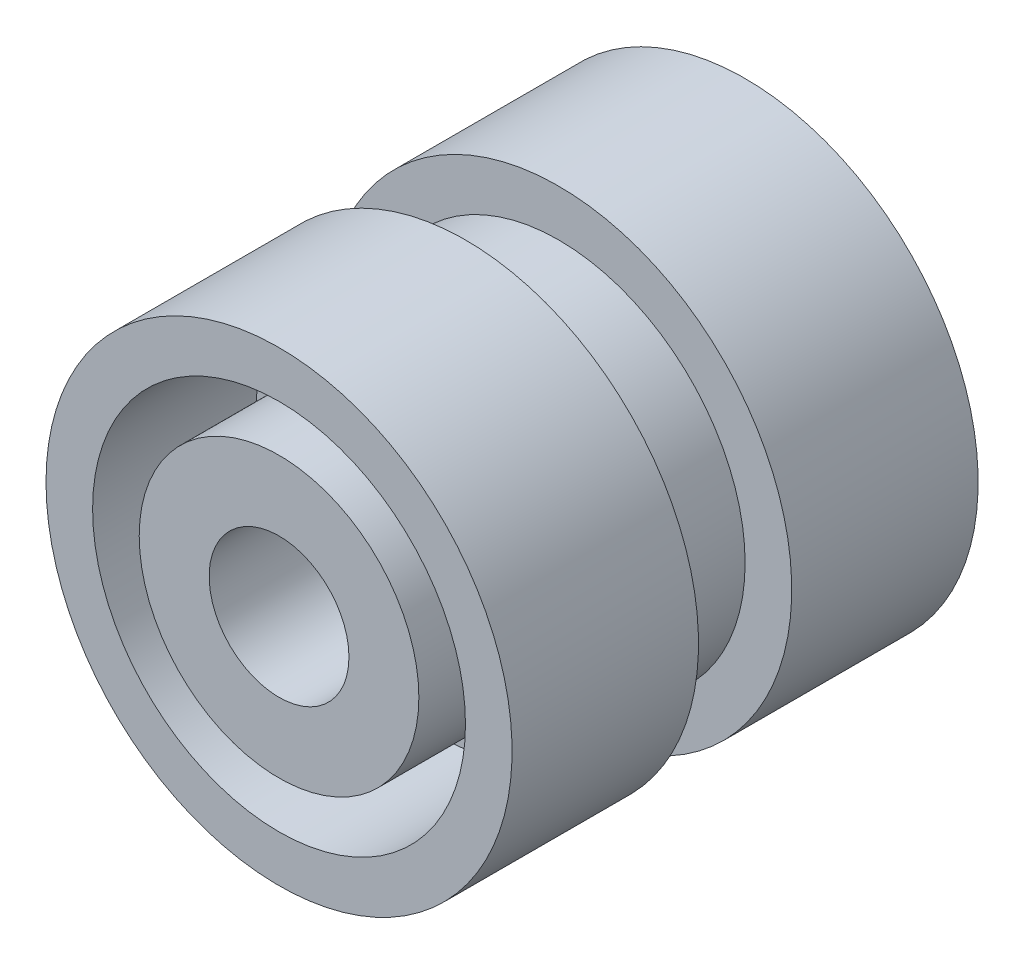
ISO-10303-21;
HEADER;
FILE_DESCRIPTION(('STEP AP214'),'2;1');
FILE_NAME('part.step','',(''),(''),'','','');
FILE_SCHEMA(('AUTOMOTIVE_DESIGN { 1 0 10303 214 1 1 1 1 }'));
ENDSEC;
DATA;
#1=APPLICATION_CONTEXT('core data for automotive mechanical design processes');
#2=APPLICATION_PROTOCOL_DEFINITION('international standard','automotive_design',2000,#1);
#3=PRODUCT_CONTEXT('',#1,'mechanical');
#4=PRODUCT('Part','Part','',(#3));
#5=PRODUCT_RELATED_PRODUCT_CATEGORY('part','',(#4));
#6=PRODUCT_DEFINITION_FORMATION('','',#4);
#7=PRODUCT_DEFINITION_CONTEXT('part definition',#1,'design');
#8=PRODUCT_DEFINITION('design','',#6,#7);
#9=PRODUCT_DEFINITION_SHAPE('','',#8);
#10=(LENGTH_UNIT() NAMED_UNIT(*) SI_UNIT(.MILLI.,.METRE.));
#11=(NAMED_UNIT(*) PLANE_ANGLE_UNIT() SI_UNIT($,.RADIAN.));
#12=(NAMED_UNIT(*) SI_UNIT($,.STERADIAN.) SOLID_ANGLE_UNIT());
#13=UNCERTAINTY_MEASURE_WITH_UNIT(LENGTH_MEASURE(1.E-05),#10,'distance_accuracy_value','');
#14=(GEOMETRIC_REPRESENTATION_CONTEXT(3) GLOBAL_UNCERTAINTY_ASSIGNED_CONTEXT((#13)) GLOBAL_UNIT_ASSIGNED_CONTEXT((#10,
#11,#12)) REPRESENTATION_CONTEXT('',''));
#15=CARTESIAN_POINT('',(0.,0.,0.));
#16=DIRECTION('',(0.,0.,1.));
#17=DIRECTION('',(1.,0.,0.));
#18=AXIS2_PLACEMENT_3D('',#15,#16,#17);
#19=CARTESIAN_POINT('',(0.,4.,-1.5));
#20=DIRECTION('',(0.,0.,-1.));
#21=DIRECTION('',(-1.,0.,0.));
#22=AXIS2_PLACEMENT_3D('',#19,#20,#21);
#23=PLANE('',#22);
#24=CARTESIAN_POINT('',(0.,0.,-1.5));
#25=DIRECTION('',(0.,0.,-1.));
#26=DIRECTION('',(-1.,0.,0.));
#27=AXIS2_PLACEMENT_3D('',#24,#25,#26);
#28=CIRCLE('',#27,2.);
#29=CARTESIAN_POINT('',(1.93649167310371,-0.5,-1.5));
#30=VERTEX_POINT('',#29);
#31=CARTESIAN_POINT('',(0.5,-1.93649167310371,-1.5));
#32=VERTEX_POINT('',#31);
#33=EDGE_CURVE('E54',#30,#32,#28,.T.);
#34=ORIENTED_EDGE('',*,*,#33,.F.);
#35=DIRECTION('',(-1.,0.,0.));
#36=VECTOR('',#35,1.);
#37=CARTESIAN_POINT('',(1.93649167310371,-0.5,-1.5));
#38=LINE('',#37,#36);
#39=CARTESIAN_POINT('',(3.96862696659689,-0.500000000000001,-1.5));
#40=VERTEX_POINT('',#39);
#41=EDGE_CURVE('E275',#40,#30,#38,.T.);
#42=ORIENTED_EDGE('',*,*,#41,.F.);
#43=CARTESIAN_POINT('',(0.,0.,-1.5));
#44=DIRECTION('',(0.,0.,-1.));
#45=DIRECTION('',(-1.,0.,0.));
#46=AXIS2_PLACEMENT_3D('',#43,#44,#45);
#47=CIRCLE('',#46,4.);
#48=CARTESIAN_POINT('',(0.500000000000001,-3.96862696659689,-1.5));
#49=VERTEX_POINT('',#48);
#50=EDGE_CURVE('E185',#40,#49,#47,.T.);
#51=ORIENTED_EDGE('',*,*,#50,.T.);
#52=DIRECTION('',(0.,-1.,0.));
#53=VECTOR('',#52,1.);
#54=CARTESIAN_POINT('',(0.5,-1.93649167310371,-1.5));
#55=LINE('',#54,#53);
#56=EDGE_CURVE('E59',#32,#49,#55,.T.);
#57=ORIENTED_EDGE('',*,*,#56,.F.);
#58=EDGE_LOOP('',(#34,#42,#51,#57));
#59=FACE_BOUND('',#58,.T.);
#60=ADVANCED_FACE('F39',(#59),#23,.T.);
#61=CARTESIAN_POINT('',(0.,0.,-1.5));
#62=DIRECTION('',(0.,0.,-1.));
#63=DIRECTION('',(-1.,0.,0.));
#64=AXIS2_PLACEMENT_3D('',#61,#62,#63);
#65=CIRCLE('',#64,2.);
#66=CARTESIAN_POINT('',(-0.5,-1.93649167310371,-1.5));
#67=VERTEX_POINT('',#66);
#68=CARTESIAN_POINT('',(-1.93649167310371,-0.499999999999999,-1.5));
#69=VERTEX_POINT('',#68);
#70=EDGE_CURVE('E292',#67,#69,#65,.T.);
#71=ORIENTED_EDGE('',*,*,#70,.F.);
#72=DIRECTION('',(0.,1.,0.));
#73=VECTOR('',#72,1.);
#74=CARTESIAN_POINT('',(-0.5,-1.93649167310371,-1.5));
#75=LINE('',#74,#73);
#76=CARTESIAN_POINT('',(-0.5,-3.96862696659689,-1.5));
#77=VERTEX_POINT('',#76);
#78=EDGE_CURVE('E288',#77,#67,#75,.T.);
#79=ORIENTED_EDGE('',*,*,#78,.F.);
#80=CARTESIAN_POINT('',(-3.96862696659689,-0.500000000000001,-1.5));
#81=VERTEX_POINT('',#80);
#82=EDGE_CURVE('E180',#77,#81,#47,.T.);
#83=ORIENTED_EDGE('',*,*,#82,.T.);
#84=DIRECTION('',(-1.,0.,0.));
#85=VECTOR('',#84,1.);
#86=CARTESIAN_POINT('',(-1.93649167310371,-0.5,-1.5));
#87=LINE('',#86,#85);
#88=EDGE_CURVE('E296',#69,#81,#87,.T.);
#89=ORIENTED_EDGE('',*,*,#88,.F.);
#90=EDGE_LOOP('',(#71,#79,#83,#89));
#91=FACE_BOUND('',#90,.T.);
#92=ADVANCED_FACE('F251',(#91),#23,.T.);
#93=CARTESIAN_POINT('',(0.,0.,-1.5));
#94=DIRECTION('',(0.,0.,-1.));
#95=DIRECTION('',(-1.,0.,0.));
#96=AXIS2_PLACEMENT_3D('',#93,#94,#95);
#97=CIRCLE('',#96,2.);
#98=CARTESIAN_POINT('',(-1.93649167310371,0.5,-1.5));
#99=VERTEX_POINT('',#98);
#100=CARTESIAN_POINT('',(-0.5,1.93649167310371,-1.5));
#101=VERTEX_POINT('',#100);
#102=EDGE_CURVE('E304',#99,#101,#97,.T.);
#103=ORIENTED_EDGE('',*,*,#102,.F.);
#104=DIRECTION('',(1.,0.,0.));
#105=VECTOR('',#104,1.);
#106=CARTESIAN_POINT('',(-1.93649167310371,0.5,-1.5));
#107=LINE('',#106,#105);
#108=CARTESIAN_POINT('',(-3.96862696659689,0.5,-1.5));
#109=VERTEX_POINT('',#108);
#110=EDGE_CURVE('E300',#109,#99,#107,.T.);
#111=ORIENTED_EDGE('',*,*,#110,.F.);
#112=CARTESIAN_POINT('',(-0.5,3.96862696659689,-1.5));
#113=VERTEX_POINT('',#112);
#114=EDGE_CURVE('E187',#109,#113,#47,.T.);
#115=ORIENTED_EDGE('',*,*,#114,.T.);
#116=DIRECTION('',(0.,1.,0.));
#117=VECTOR('',#116,1.);
#118=CARTESIAN_POINT('',(-0.5,1.93649167310371,-1.5));
#119=LINE('',#118,#117);
#120=EDGE_CURVE('E308',#101,#113,#119,.T.);
#121=ORIENTED_EDGE('',*,*,#120,.F.);
#122=EDGE_LOOP('',(#103,#111,#115,#121));
#123=FACE_BOUND('',#122,.T.);
#124=ADVANCED_FACE('F256',(#123),#23,.T.);
#125=CARTESIAN_POINT('',(0.5,3.96862696659689,-1.5));
#126=VERTEX_POINT('',#125);
#127=CARTESIAN_POINT('',(3.96862696659689,0.499999999999999,-1.5));
#128=VERTEX_POINT('',#127);
#129=EDGE_CURVE('E195',#126,#128,#47,.T.);
#130=ORIENTED_EDGE('',*,*,#129,.T.);
#131=DIRECTION('',(1.,0.,0.));
#132=VECTOR('',#131,1.);
#133=CARTESIAN_POINT('',(1.93649167310371,0.5,-1.5));
#134=LINE('',#133,#132);
#135=CARTESIAN_POINT('',(1.93649167310371,0.5,-1.5));
#136=VERTEX_POINT('',#135);
#137=EDGE_CURVE('E269',#136,#128,#134,.T.);
#138=ORIENTED_EDGE('',*,*,#137,.F.);
#139=CARTESIAN_POINT('',(0.,0.,-1.5));
#140=DIRECTION('',(0.,0.,-1.));
#141=DIRECTION('',(-1.,0.,0.));
#142=AXIS2_PLACEMENT_3D('',#139,#140,#141);
#143=CIRCLE('',#142,2.);
#144=CARTESIAN_POINT('',(0.5,1.93649167310371,-1.5));
#145=VERTEX_POINT('',#144);
#146=EDGE_CURVE('E178',#145,#136,#143,.T.);
#147=ORIENTED_EDGE('',*,*,#146,.F.);
#148=DIRECTION('',(0.,-1.,0.));
#149=VECTOR('',#148,1.);
#150=CARTESIAN_POINT('',(0.5,1.93649167310371,-1.5));
#151=LINE('',#150,#149);
#152=EDGE_CURVE('E175',#126,#145,#151,.T.);
#153=ORIENTED_EDGE('',*,*,#152,.F.);
#154=EDGE_LOOP('',(#130,#138,#147,#153));
#155=FACE_BOUND('',#154,.T.);
#156=ADVANCED_FACE('F252',(#155),#23,.T.);
#157=CARTESIAN_POINT('',(0.,0.,0.));
#158=DIRECTION('',(0.,0.,-1.));
#159=DIRECTION('',(-1.,0.,0.));
#160=AXIS2_PLACEMENT_3D('',#157,#158,#159);
#161=CYLINDRICAL_SURFACE('',#160,4.);
#162=CARTESIAN_POINT('',(0.,0.,-5.));
#163=DIRECTION('',(0.,0.,-1.));
#164=DIRECTION('',(-1.,0.,0.));
#165=AXIS2_PLACEMENT_3D('',#162,#163,#164);
#166=CIRCLE('',#165,4.);
#167=CARTESIAN_POINT('',(-4.,0.,-5.));
#168=VERTEX_POINT('',#167);
#169=EDGE_CURVE('E194',#168,#168,#166,.T.);
#170=ORIENTED_EDGE('',*,*,#169,.T.);
#171=EDGE_LOOP('',(#170));
#172=FACE_BOUND('',#171,.T.);
#173=CARTESIAN_POINT('',(0.,0.,-3.5));
#174=DIRECTION('',(0.,0.,-1.));
#175=DIRECTION('',(-1.,0.,0.));
#176=AXIS2_PLACEMENT_3D('',#173,#174,#175);
#177=CIRCLE('',#176,4.);
#178=CARTESIAN_POINT('',(-0.5,3.96862696659689,-3.5));
#179=VERTEX_POINT('',#178);
#180=CARTESIAN_POINT('',(0.5,3.96862696659689,-3.5));
#181=VERTEX_POINT('',#180);
#182=EDGE_CURVE('E408',#179,#181,#177,.T.);
#183=ORIENTED_EDGE('',*,*,#182,.F.);
#184=DIRECTION('',(0.,0.,1.));
#185=VECTOR('',#184,1.);
#186=CARTESIAN_POINT('',(-0.5,3.96862696659689,-3.5));
#187=LINE('',#186,#185);
#188=EDGE_CURVE('E320',#179,#113,#187,.T.);
#189=ORIENTED_EDGE('',*,*,#188,.T.);
#190=ORIENTED_EDGE('',*,*,#114,.F.);
#191=DIRECTION('',(0.,0.,1.));
#192=VECTOR('',#191,1.);
#193=CARTESIAN_POINT('',(-3.96862696659689,0.5,-3.5));
#194=LINE('',#193,#192);
#195=CARTESIAN_POINT('',(-3.96862696659689,0.5,-3.5));
#196=VERTEX_POINT('',#195);
#197=EDGE_CURVE('E331',#196,#109,#194,.T.);
#198=ORIENTED_EDGE('',*,*,#197,.F.);
#199=CARTESIAN_POINT('',(0.,0.,-3.5));
#200=DIRECTION('',(0.,0.,-1.));
#201=DIRECTION('',(-1.,0.,0.));
#202=AXIS2_PLACEMENT_3D('',#199,#200,#201);
#203=CIRCLE('',#202,4.);
#204=CARTESIAN_POINT('',(-3.96862696659689,-0.5,-3.5));
#205=VERTEX_POINT('',#204);
#206=EDGE_CURVE('E394',#205,#196,#203,.T.);
#207=ORIENTED_EDGE('',*,*,#206,.F.);
#208=DIRECTION('',(0.,0.,1.));
#209=VECTOR('',#208,1.);
#210=CARTESIAN_POINT('',(-3.96862696659689,-0.500000000000001,-3.5));
#211=LINE('',#210,#209);
#212=EDGE_CURVE('E335',#205,#81,#211,.T.);
#213=ORIENTED_EDGE('',*,*,#212,.T.);
#214=ORIENTED_EDGE('',*,*,#82,.F.);
#215=DIRECTION('',(0.,0.,1.));
#216=VECTOR('',#215,1.);
#217=CARTESIAN_POINT('',(-0.5,-3.96862696659689,-3.5));
#218=LINE('',#217,#216);
#219=CARTESIAN_POINT('',(-0.5,-3.96862696659689,-3.5));
#220=VERTEX_POINT('',#219);
#221=EDGE_CURVE('E346',#220,#77,#218,.T.);
#222=ORIENTED_EDGE('',*,*,#221,.F.);
#223=CARTESIAN_POINT('',(0.,0.,-3.5));
#224=DIRECTION('',(0.,0.,-1.));
#225=DIRECTION('',(-1.,0.,0.));
#226=AXIS2_PLACEMENT_3D('',#223,#224,#225);
#227=CIRCLE('',#226,4.);
#228=CARTESIAN_POINT('',(0.5,-3.96862696659689,-3.5));
#229=VERTEX_POINT('',#228);
#230=EDGE_CURVE('E380',#229,#220,#227,.T.);
#231=ORIENTED_EDGE('',*,*,#230,.F.);
#232=DIRECTION('',(0.,0.,1.));
#233=VECTOR('',#232,1.);
#234=CARTESIAN_POINT('',(0.500000000000001,-3.96862696659689,-3.5));
#235=LINE('',#234,#233);
#236=EDGE_CURVE('E350',#229,#49,#235,.T.);
#237=ORIENTED_EDGE('',*,*,#236,.T.);
#238=ORIENTED_EDGE('',*,*,#50,.F.);
#239=DIRECTION('',(0.,0.,1.));
#240=VECTOR('',#239,1.);
#241=CARTESIAN_POINT('',(3.96862696659689,-0.500000000000001,-3.5));
#242=LINE('',#241,#240);
#243=CARTESIAN_POINT('',(3.96862696659689,-0.500000000000001,-3.5));
#244=VERTEX_POINT('',#243);
#245=EDGE_CURVE('E188',#244,#40,#242,.T.);
#246=ORIENTED_EDGE('',*,*,#245,.F.);
#247=CARTESIAN_POINT('',(0.,0.,-3.5));
#248=DIRECTION('',(0.,0.,-1.));
#249=DIRECTION('',(-1.,0.,0.));
#250=AXIS2_PLACEMENT_3D('',#247,#248,#249);
#251=CIRCLE('',#250,4.);
#252=CARTESIAN_POINT('',(3.96862696659689,0.499999999999999,-3.5));
#253=VERTEX_POINT('',#252);
#254=EDGE_CURVE('E163',#253,#244,#251,.T.);
#255=ORIENTED_EDGE('',*,*,#254,.F.);
#256=DIRECTION('',(0.,0.,1.));
#257=VECTOR('',#256,1.);
#258=CARTESIAN_POINT('',(3.96862696659689,0.499999999999999,-3.5));
#259=LINE('',#258,#257);
#260=EDGE_CURVE('E159',#253,#128,#259,.T.);
#261=ORIENTED_EDGE('',*,*,#260,.T.);
#262=ORIENTED_EDGE('',*,*,#129,.F.);
#263=DIRECTION('',(0.,0.,1.));
#264=VECTOR('',#263,1.);
#265=CARTESIAN_POINT('',(0.5,3.96862696659689,-3.5));
#266=LINE('',#265,#264);
#267=EDGE_CURVE('E317',#181,#126,#266,.T.);
#268=ORIENTED_EDGE('',*,*,#267,.F.);
#269=EDGE_LOOP('',(#183,#189,#190,#198,#207,#213,#214,#222,#231,#237,#238,#246,#255,#261,#262,#268));
#270=FACE_BOUND('',#269,.T.);
#271=ADVANCED_FACE('F248',(#172,#270),#161,.F.);
#272=CARTESIAN_POINT('',(0.,0.,5.));
#273=DIRECTION('',(0.,0.,1.));
#274=DIRECTION('',(1.,0.,0.));
#275=AXIS2_PLACEMENT_3D('',#272,#273,#274);
#276=PLANE('',#275);
#277=CARTESIAN_POINT('',(0.,0.,5.));
#278=DIRECTION('',(0.,0.,1.));
#279=DIRECTION('',(1.,0.,0.));
#280=AXIS2_PLACEMENT_3D('',#277,#278,#279);
#281=CIRCLE('',#280,1.5);
#282=CARTESIAN_POINT('',(1.5,0.,5.));
#283=VERTEX_POINT('',#282);
#284=EDGE_CURVE('E630',#283,#283,#281,.T.);
#285=ORIENTED_EDGE('',*,*,#284,.F.);
#286=EDGE_LOOP('',(#285));
#287=FACE_BOUND('',#286,.T.);
#288=CARTESIAN_POINT('',(0.,0.,5.));
#289=DIRECTION('',(0.,0.,-1.));
#290=DIRECTION('',(-1.,0.,0.));
#291=AXIS2_PLACEMENT_3D('',#288,#289,#290);
#292=CIRCLE('',#291,3.);
#293=CARTESIAN_POINT('',(-3.,0.,5.));
#294=VERTEX_POINT('',#293);
#295=EDGE_CURVE('E11',#294,#294,#292,.T.);
#296=ORIENTED_EDGE('',*,*,#295,.F.);
#297=EDGE_LOOP('',(#296));
#298=FACE_BOUND('',#297,.T.);
#299=ADVANCED_FACE('F239',(#287,#298),#276,.T.);
#300=CARTESIAN_POINT('',(0.,0.,0.));
#301=DIRECTION('',(0.,0.,-1.));
#302=DIRECTION('',(-1.,0.,0.));
#303=AXIS2_PLACEMENT_3D('',#300,#301,#302);
#304=CYLINDRICAL_SURFACE('',#303,3.);
#305=ORIENTED_EDGE('',*,*,#295,.T.);
#306=EDGE_LOOP('',(#305));
#307=FACE_BOUND('',#306,.T.);
#308=CARTESIAN_POINT('',(0.,0.,1.5));
#309=DIRECTION('',(0.,0.,-1.));
#310=DIRECTION('',(-1.,0.,0.));
#311=AXIS2_PLACEMENT_3D('',#308,#309,#310);
#312=CIRCLE('',#311,3.);
#313=CARTESIAN_POINT('',(-3.,0.,1.5));
#314=VERTEX_POINT('',#313);
#315=EDGE_CURVE('E47',#314,#314,#312,.T.);
#316=ORIENTED_EDGE('',*,*,#315,.F.);
#317=EDGE_LOOP('',(#316));
#318=FACE_BOUND('',#317,.T.);
#319=ADVANCED_FACE('F237',(#307,#318),#304,.T.);
#320=CARTESIAN_POINT('',(0.,3.,1.5));
#321=DIRECTION('',(0.,0.,1.));
#322=DIRECTION('',(1.,0.,0.));
#323=AXIS2_PLACEMENT_3D('',#320,#321,#322);
#324=PLANE('',#323);
#325=ORIENTED_EDGE('',*,*,#315,.T.);
#326=EDGE_LOOP('',(#325));
#327=FACE_BOUND('',#326,.T.);
#328=CARTESIAN_POINT('',(0.,0.,1.5));
#329=DIRECTION('',(0.,0.,-1.));
#330=DIRECTION('',(-1.,0.,0.));
#331=AXIS2_PLACEMENT_3D('',#328,#329,#330);
#332=CIRCLE('',#331,4.);
#333=CARTESIAN_POINT('',(-4.,0.,1.5));
#334=VERTEX_POINT('',#333);
#335=EDGE_CURVE('E227',#334,#334,#332,.T.);
#336=ORIENTED_EDGE('',*,*,#335,.F.);
#337=EDGE_LOOP('',(#336));
#338=FACE_BOUND('',#337,.T.);
#339=ADVANCED_FACE('F234',(#327,#338),#324,.T.);
#340=CARTESIAN_POINT('',(0.,0.,0.));
#341=DIRECTION('',(0.,0.,-1.));
#342=DIRECTION('',(-1.,0.,0.));
#343=AXIS2_PLACEMENT_3D('',#340,#341,#342);
#344=CYLINDRICAL_SURFACE('',#343,4.);
#345=ORIENTED_EDGE('',*,*,#335,.T.);
#346=EDGE_LOOP('',(#345));
#347=FACE_BOUND('',#346,.T.);
#348=CARTESIAN_POINT('',(0.,0.,5.));
#349=DIRECTION('',(0.,0.,-1.));
#350=DIRECTION('',(-1.,0.,0.));
#351=AXIS2_PLACEMENT_3D('',#348,#349,#350);
#352=CIRCLE('',#351,4.);
#353=CARTESIAN_POINT('',(-4.,0.,5.));
#354=VERTEX_POINT('',#353);
#355=EDGE_CURVE('E223',#354,#354,#352,.T.);
#356=ORIENTED_EDGE('',*,*,#355,.F.);
#357=EDGE_LOOP('',(#356));
#358=FACE_BOUND('',#357,.T.);
#359=ADVANCED_FACE('F246',(#347,#358),#344,.F.);
#360=CARTESIAN_POINT('',(0.,4.,5.));
#361=DIRECTION('',(0.,0.,1.));
#362=DIRECTION('',(1.,0.,0.));
#363=AXIS2_PLACEMENT_3D('',#360,#361,#362);
#364=PLANE('',#363);
#365=ORIENTED_EDGE('',*,*,#355,.T.);
#366=EDGE_LOOP('',(#365));
#367=FACE_BOUND('',#366,.T.);
#368=CARTESIAN_POINT('',(0.,0.,5.));
#369=DIRECTION('',(0.,0.,-1.));
#370=DIRECTION('',(-1.,0.,0.));
#371=AXIS2_PLACEMENT_3D('',#368,#369,#370);
#372=CIRCLE('',#371,5.);
#373=CARTESIAN_POINT('',(-5.,0.,5.));
#374=VERTEX_POINT('',#373);
#375=EDGE_CURVE('E219',#374,#374,#372,.T.);
#376=ORIENTED_EDGE('',*,*,#375,.F.);
#377=EDGE_LOOP('',(#376));
#378=FACE_BOUND('',#377,.T.);
#379=ADVANCED_FACE('F485',(#367,#378),#364,.T.);
#380=CARTESIAN_POINT('',(0.,0.,0.));
#381=DIRECTION('',(0.,0.,-1.));
#382=DIRECTION('',(-1.,0.,0.));
#383=AXIS2_PLACEMENT_3D('',#380,#381,#382);
#384=CYLINDRICAL_SURFACE('',#383,5.);
#385=ORIENTED_EDGE('',*,*,#375,.T.);
#386=EDGE_LOOP('',(#385));
#387=FACE_BOUND('',#386,.T.);
#388=CARTESIAN_POINT('',(0.,0.,1.));
#389=DIRECTION('',(0.,0.,-1.));
#390=DIRECTION('',(-1.,0.,0.));
#391=AXIS2_PLACEMENT_3D('',#388,#389,#390);
#392=CIRCLE('',#391,5.);
#393=CARTESIAN_POINT('',(-5.,0.,1.));
#394=VERTEX_POINT('',#393);
#395=EDGE_CURVE('E215',#394,#394,#392,.T.);
#396=ORIENTED_EDGE('',*,*,#395,.F.);
#397=EDGE_LOOP('',(#396));
#398=FACE_BOUND('',#397,.T.);
#399=ADVANCED_FACE('F481',(#387,#398),#384,.T.);
#400=CARTESIAN_POINT('',(0.,5.,1.));
#401=DIRECTION('',(0.,0.,-1.));
#402=DIRECTION('',(-1.,0.,0.));
#403=AXIS2_PLACEMENT_3D('',#400,#401,#402);
#404=PLANE('',#403);
#405=ORIENTED_EDGE('',*,*,#395,.T.);
#406=EDGE_LOOP('',(#405));
#407=FACE_BOUND('',#406,.T.);
#408=CARTESIAN_POINT('',(0.,0.,1.));
#409=DIRECTION('',(0.,0.,-1.));
#410=DIRECTION('',(-1.,0.,0.));
#411=AXIS2_PLACEMENT_3D('',#408,#409,#410);
#412=CIRCLE('',#411,4.);
#413=CARTESIAN_POINT('',(-4.,0.,1.));
#414=VERTEX_POINT('',#413);
#415=EDGE_CURVE('E211',#414,#414,#412,.T.);
#416=ORIENTED_EDGE('',*,*,#415,.F.);
#417=EDGE_LOOP('',(#416));
#418=FACE_BOUND('',#417,.T.);
#419=ADVANCED_FACE('F477',(#407,#418),#404,.T.);
#420=CARTESIAN_POINT('',(0.,0.,0.));
#421=DIRECTION('',(0.,0.,-1.));
#422=DIRECTION('',(-1.,0.,0.));
#423=AXIS2_PLACEMENT_3D('',#420,#421,#422);
#424=CYLINDRICAL_SURFACE('',#423,4.);
#425=ORIENTED_EDGE('',*,*,#415,.T.);
#426=EDGE_LOOP('',(#425));
#427=FACE_BOUND('',#426,.T.);
#428=CARTESIAN_POINT('',(0.,0.,-1.));
#429=DIRECTION('',(0.,0.,-1.));
#430=DIRECTION('',(-1.,0.,0.));
#431=AXIS2_PLACEMENT_3D('',#428,#429,#430);
#432=CIRCLE('',#431,4.);
#433=CARTESIAN_POINT('',(-4.,0.,-1.));
#434=VERTEX_POINT('',#433);
#435=EDGE_CURVE('E207',#434,#434,#432,.T.);
#436=ORIENTED_EDGE('',*,*,#435,.F.);
#437=EDGE_LOOP('',(#436));
#438=FACE_BOUND('',#437,.T.);
#439=ADVANCED_FACE('F473',(#427,#438),#424,.T.);
#440=CARTESIAN_POINT('',(0.,5.,-1.));
#441=DIRECTION('',(0.,0.,1.));
#442=DIRECTION('',(1.,0.,0.));
#443=AXIS2_PLACEMENT_3D('',#440,#441,#442);
#444=PLANE('',#443);
#445=ORIENTED_EDGE('',*,*,#435,.T.);
#446=EDGE_LOOP('',(#445));
#447=FACE_BOUND('',#446,.T.);
#448=CARTESIAN_POINT('',(0.,0.,-1.));
#449=DIRECTION('',(0.,0.,-1.));
#450=DIRECTION('',(-1.,0.,0.));
#451=AXIS2_PLACEMENT_3D('',#448,#449,#450);
#452=CIRCLE('',#451,5.);
#453=CARTESIAN_POINT('',(-5.,0.,-1.));
#454=VERTEX_POINT('',#453);
#455=EDGE_CURVE('E203',#454,#454,#452,.T.);
#456=ORIENTED_EDGE('',*,*,#455,.F.);
#457=EDGE_LOOP('',(#456));
#458=FACE_BOUND('',#457,.T.);
#459=ADVANCED_FACE('F469',(#447,#458),#444,.T.);
#460=CARTESIAN_POINT('',(0.,0.,0.));
#461=DIRECTION('',(0.,0.,-1.));
#462=DIRECTION('',(-1.,0.,0.));
#463=AXIS2_PLACEMENT_3D('',#460,#461,#462);
#464=CYLINDRICAL_SURFACE('',#463,5.);
#465=ORIENTED_EDGE('',*,*,#455,.T.);
#466=EDGE_LOOP('',(#465));
#467=FACE_BOUND('',#466,.T.);
#468=CARTESIAN_POINT('',(0.,0.,-5.));
#469=DIRECTION('',(0.,0.,-1.));
#470=DIRECTION('',(-1.,0.,0.));
#471=AXIS2_PLACEMENT_3D('',#468,#469,#470);
#472=CIRCLE('',#471,5.);
#473=CARTESIAN_POINT('',(-5.,0.,-5.));
#474=VERTEX_POINT('',#473);
#475=EDGE_CURVE('E199',#474,#474,#472,.T.);
#476=ORIENTED_EDGE('',*,*,#475,.F.);
#477=EDGE_LOOP('',(#476));
#478=FACE_BOUND('',#477,.T.);
#479=ADVANCED_FACE('F465',(#467,#478),#464,.T.);
#480=CARTESIAN_POINT('',(0.,4.,-5.));
#481=DIRECTION('',(0.,0.,-1.));
#482=DIRECTION('',(-1.,0.,0.));
#483=AXIS2_PLACEMENT_3D('',#480,#481,#482);
#484=PLANE('',#483);
#485=ORIENTED_EDGE('',*,*,#475,.T.);
#486=EDGE_LOOP('',(#485));
#487=FACE_BOUND('',#486,.T.);
#488=ORIENTED_EDGE('',*,*,#169,.F.);
#489=EDGE_LOOP('',(#488));
#490=FACE_BOUND('',#489,.T.);
#491=ADVANCED_FACE('F461',(#487,#490),#484,.T.);
#492=CARTESIAN_POINT('',(0.,0.,-3.5));
#493=DIRECTION('',(0.,0.,1.));
#494=DIRECTION('',(1.,0.,0.));
#495=AXIS2_PLACEMENT_3D('',#492,#493,#494);
#496=CYLINDRICAL_SURFACE('',#495,2.);
#497=ORIENTED_EDGE('',*,*,#146,.T.);
#498=DIRECTION('',(0.,0.,1.));
#499=VECTOR('',#498,1.);
#500=CARTESIAN_POINT('',(1.93649167310371,0.5,-3.5));
#501=LINE('',#500,#499);
#502=CARTESIAN_POINT('',(1.93649167310371,0.5,-3.5));
#503=VERTEX_POINT('',#502);
#504=EDGE_CURVE('E157',#503,#136,#501,.T.);
#505=ORIENTED_EDGE('',*,*,#504,.F.);
#506=CARTESIAN_POINT('',(0.,0.,-3.5));
#507=DIRECTION('',(0.,0.,-1.));
#508=DIRECTION('',(-1.,0.,0.));
#509=AXIS2_PLACEMENT_3D('',#506,#507,#508);
#510=CIRCLE('',#509,2.);
#511=CARTESIAN_POINT('',(0.5,1.93649167310371,-3.5));
#512=VERTEX_POINT('',#511);
#513=EDGE_CURVE('E164',#512,#503,#510,.T.);
#514=ORIENTED_EDGE('',*,*,#513,.F.);
#515=DIRECTION('',(0.,0.,1.));
#516=VECTOR('',#515,1.);
#517=CARTESIAN_POINT('',(0.5,1.93649167310371,-3.5));
#518=LINE('',#517,#516);
#519=EDGE_CURVE('E314',#512,#145,#518,.T.);
#520=ORIENTED_EDGE('',*,*,#519,.T.);
#521=EDGE_LOOP('',(#497,#505,#514,#520));
#522=FACE_BOUND('',#521,.T.);
#523=ADVANCED_FACE('F177',(#522),#496,.T.);
#524=CARTESIAN_POINT('',(1.93649167310371,0.5,-3.5));
#525=DIRECTION('',(0.,-1.,0.));
#526=DIRECTION('',(1.,0.,0.));
#527=AXIS2_PLACEMENT_3D('',#524,#525,#526);
#528=PLANE('',#527);
#529=ORIENTED_EDGE('',*,*,#137,.T.);
#530=ORIENTED_EDGE('',*,*,#260,.F.);
#531=DIRECTION('',(1.,0.,0.));
#532=VECTOR('',#531,1.);
#533=CARTESIAN_POINT('',(1.93649167310371,0.5,-3.5));
#534=LINE('',#533,#532);
#535=EDGE_CURVE('E152',#503,#253,#534,.T.);
#536=ORIENTED_EDGE('',*,*,#535,.F.);
#537=ORIENTED_EDGE('',*,*,#504,.T.);
#538=EDGE_LOOP('',(#529,#530,#536,#537));
#539=FACE_BOUND('',#538,.T.);
#540=ADVANCED_FACE('F155',(#539),#528,.F.);
#541=CARTESIAN_POINT('',(1.93649167310371,-0.5,-3.5));
#542=DIRECTION('',(0.,1.,0.));
#543=DIRECTION('',(-1.,0.,0.));
#544=AXIS2_PLACEMENT_3D('',#541,#542,#543);
#545=PLANE('',#544);
#546=ORIENTED_EDGE('',*,*,#41,.T.);
#547=DIRECTION('',(0.,0.,1.));
#548=VECTOR('',#547,1.);
#549=CARTESIAN_POINT('',(1.93649167310371,-0.5,-3.5));
#550=LINE('',#549,#548);
#551=CARTESIAN_POINT('',(1.93649167310371,-0.5,-3.5));
#552=VERTEX_POINT('',#551);
#553=EDGE_CURVE('E357',#552,#30,#550,.T.);
#554=ORIENTED_EDGE('',*,*,#553,.F.);
#555=DIRECTION('',(-1.,0.,0.));
#556=VECTOR('',#555,1.);
#557=CARTESIAN_POINT('',(1.93649167310371,-0.5,-3.5));
#558=LINE('',#557,#556);
#559=EDGE_CURVE('E366',#244,#552,#558,.T.);
#560=ORIENTED_EDGE('',*,*,#559,.F.);
#561=ORIENTED_EDGE('',*,*,#245,.T.);
#562=EDGE_LOOP('',(#546,#554,#560,#561));
#563=FACE_BOUND('',#562,.T.);
#564=ADVANCED_FACE('F364',(#563),#545,.F.);
#565=CARTESIAN_POINT('',(0.,0.,-3.5));
#566=DIRECTION('',(0.,0.,1.));
#567=DIRECTION('',(1.,0.,0.));
#568=AXIS2_PLACEMENT_3D('',#565,#566,#567);
#569=CYLINDRICAL_SURFACE('',#568,2.);
#570=ORIENTED_EDGE('',*,*,#33,.T.);
#571=DIRECTION('',(0.,0.,1.));
#572=VECTOR('',#571,1.);
#573=CARTESIAN_POINT('',(0.5,-1.93649167310371,-3.5));
#574=LINE('',#573,#572);
#575=CARTESIAN_POINT('',(0.5,-1.93649167310371,-3.5));
#576=VERTEX_POINT('',#575);
#577=EDGE_CURVE('E353',#576,#32,#574,.T.);
#578=ORIENTED_EDGE('',*,*,#577,.F.);
#579=CARTESIAN_POINT('',(0.,0.,-3.5));
#580=DIRECTION('',(0.,0.,-1.));
#581=DIRECTION('',(-1.,0.,0.));
#582=AXIS2_PLACEMENT_3D('',#579,#580,#581);
#583=CIRCLE('',#582,2.);
#584=EDGE_CURVE('E371',#552,#576,#583,.T.);
#585=ORIENTED_EDGE('',*,*,#584,.F.);
#586=ORIENTED_EDGE('',*,*,#553,.T.);
#587=EDGE_LOOP('',(#570,#578,#585,#586));
#588=FACE_BOUND('',#587,.T.);
#589=ADVANCED_FACE('F451',(#588),#569,.T.);
#590=CARTESIAN_POINT('',(0.5,-1.93649167310371,-3.5));
#591=DIRECTION('',(-1.,0.,0.));
#592=DIRECTION('',(0.,-1.,0.));
#593=AXIS2_PLACEMENT_3D('',#590,#591,#592);
#594=PLANE('',#593);
#595=ORIENTED_EDGE('',*,*,#56,.T.);
#596=ORIENTED_EDGE('',*,*,#236,.F.);
#597=DIRECTION('',(0.,-1.,0.));
#598=VECTOR('',#597,1.);
#599=CARTESIAN_POINT('',(0.5,-1.93649167310371,-3.5));
#600=LINE('',#599,#598);
#601=EDGE_CURVE('E376',#576,#229,#600,.T.);
#602=ORIENTED_EDGE('',*,*,#601,.F.);
#603=ORIENTED_EDGE('',*,*,#577,.T.);
#604=EDGE_LOOP('',(#595,#596,#602,#603));
#605=FACE_BOUND('',#604,.T.);
#606=ADVANCED_FACE('F447',(#605),#594,.F.);
#607=CARTESIAN_POINT('',(-0.5,-1.93649167310371,-3.5));
#608=DIRECTION('',(1.,0.,0.));
#609=DIRECTION('',(0.,1.,0.));
#610=AXIS2_PLACEMENT_3D('',#607,#608,#609);
#611=PLANE('',#610);
#612=ORIENTED_EDGE('',*,*,#78,.T.);
#613=DIRECTION('',(0.,0.,1.));
#614=VECTOR('',#613,1.);
#615=CARTESIAN_POINT('',(-0.5,-1.93649167310371,-3.5));
#616=LINE('',#615,#614);
#617=CARTESIAN_POINT('',(-0.5,-1.93649167310371,-3.5));
#618=VERTEX_POINT('',#617);
#619=EDGE_CURVE('E342',#618,#67,#616,.T.);
#620=ORIENTED_EDGE('',*,*,#619,.F.);
#621=DIRECTION('',(0.,1.,0.));
#622=VECTOR('',#621,1.);
#623=CARTESIAN_POINT('',(-0.5,-1.93649167310371,-3.5));
#624=LINE('',#623,#622);
#625=EDGE_CURVE('E384',#220,#618,#624,.T.);
#626=ORIENTED_EDGE('',*,*,#625,.F.);
#627=ORIENTED_EDGE('',*,*,#221,.T.);
#628=EDGE_LOOP('',(#612,#620,#626,#627));
#629=FACE_BOUND('',#628,.T.);
#630=ADVANCED_FACE('F443',(#629),#611,.F.);
#631=CARTESIAN_POINT('',(0.,0.,-3.5));
#632=DIRECTION('',(0.,0.,1.));
#633=DIRECTION('',(1.,0.,0.));
#634=AXIS2_PLACEMENT_3D('',#631,#632,#633);
#635=CYLINDRICAL_SURFACE('',#634,2.);
#636=ORIENTED_EDGE('',*,*,#70,.T.);
#637=DIRECTION('',(0.,0.,1.));
#638=VECTOR('',#637,1.);
#639=CARTESIAN_POINT('',(-1.93649167310371,-0.5,-3.5));
#640=LINE('',#639,#638);
#641=CARTESIAN_POINT('',(-1.93649167310371,-0.5,-3.5));
#642=VERTEX_POINT('',#641);
#643=EDGE_CURVE('E338',#642,#69,#640,.T.);
#644=ORIENTED_EDGE('',*,*,#643,.F.);
#645=CARTESIAN_POINT('',(0.,0.,-3.5));
#646=DIRECTION('',(0.,0.,-1.));
#647=DIRECTION('',(-1.,0.,0.));
#648=AXIS2_PLACEMENT_3D('',#645,#646,#647);
#649=CIRCLE('',#648,2.);
#650=EDGE_CURVE('E387',#618,#642,#649,.T.);
#651=ORIENTED_EDGE('',*,*,#650,.F.);
#652=ORIENTED_EDGE('',*,*,#619,.T.);
#653=EDGE_LOOP('',(#636,#644,#651,#652));
#654=FACE_BOUND('',#653,.T.);
#655=ADVANCED_FACE('F439',(#654),#635,.T.);
#656=CARTESIAN_POINT('',(-1.93649167310371,-0.5,-3.5));
#657=DIRECTION('',(0.,1.,0.));
#658=DIRECTION('',(-1.,0.,0.));
#659=AXIS2_PLACEMENT_3D('',#656,#657,#658);
#660=PLANE('',#659);
#661=ORIENTED_EDGE('',*,*,#88,.T.);
#662=ORIENTED_EDGE('',*,*,#212,.F.);
#663=DIRECTION('',(-1.,0.,0.));
#664=VECTOR('',#663,1.);
#665=CARTESIAN_POINT('',(-1.93649167310371,-0.5,-3.5));
#666=LINE('',#665,#664);
#667=EDGE_CURVE('E390',#642,#205,#666,.T.);
#668=ORIENTED_EDGE('',*,*,#667,.F.);
#669=ORIENTED_EDGE('',*,*,#643,.T.);
#670=EDGE_LOOP('',(#661,#662,#668,#669));
#671=FACE_BOUND('',#670,.T.);
#672=ADVANCED_FACE('F435',(#671),#660,.F.);
#673=CARTESIAN_POINT('',(-1.93649167310371,0.5,-3.5));
#674=DIRECTION('',(0.,-1.,0.));
#675=DIRECTION('',(1.,0.,0.));
#676=AXIS2_PLACEMENT_3D('',#673,#674,#675);
#677=PLANE('',#676);
#678=ORIENTED_EDGE('',*,*,#110,.T.);
#679=DIRECTION('',(0.,0.,1.));
#680=VECTOR('',#679,1.);
#681=CARTESIAN_POINT('',(-1.93649167310371,0.5,-3.5));
#682=LINE('',#681,#680);
#683=CARTESIAN_POINT('',(-1.93649167310371,0.5,-3.5));
#684=VERTEX_POINT('',#683);
#685=EDGE_CURVE('E327',#684,#99,#682,.T.);
#686=ORIENTED_EDGE('',*,*,#685,.F.);
#687=DIRECTION('',(1.,0.,0.));
#688=VECTOR('',#687,1.);
#689=CARTESIAN_POINT('',(-1.93649167310371,0.5,-3.5));
#690=LINE('',#689,#688);
#691=EDGE_CURVE('E398',#196,#684,#690,.T.);
#692=ORIENTED_EDGE('',*,*,#691,.F.);
#693=ORIENTED_EDGE('',*,*,#197,.T.);
#694=EDGE_LOOP('',(#678,#686,#692,#693));
#695=FACE_BOUND('',#694,.T.);
#696=ADVANCED_FACE('F431',(#695),#677,.F.);
#697=CARTESIAN_POINT('',(0.,0.,-3.5));
#698=DIRECTION('',(0.,0.,1.));
#699=DIRECTION('',(1.,0.,0.));
#700=AXIS2_PLACEMENT_3D('',#697,#698,#699);
#701=CYLINDRICAL_SURFACE('',#700,2.);
#702=ORIENTED_EDGE('',*,*,#102,.T.);
#703=DIRECTION('',(0.,0.,1.));
#704=VECTOR('',#703,1.);
#705=CARTESIAN_POINT('',(-0.5,1.93649167310371,-3.5));
#706=LINE('',#705,#704);
#707=CARTESIAN_POINT('',(-0.5,1.93649167310371,-3.5));
#708=VERTEX_POINT('',#707);
#709=EDGE_CURVE('E323',#708,#101,#706,.T.);
#710=ORIENTED_EDGE('',*,*,#709,.F.);
#711=CARTESIAN_POINT('',(0.,0.,-3.5));
#712=DIRECTION('',(0.,0.,-1.));
#713=DIRECTION('',(-1.,0.,0.));
#714=AXIS2_PLACEMENT_3D('',#711,#712,#713);
#715=CIRCLE('',#714,2.);
#716=EDGE_CURVE('E401',#684,#708,#715,.T.);
#717=ORIENTED_EDGE('',*,*,#716,.F.);
#718=ORIENTED_EDGE('',*,*,#685,.T.);
#719=EDGE_LOOP('',(#702,#710,#717,#718));
#720=FACE_BOUND('',#719,.T.);
#721=ADVANCED_FACE('F424',(#720),#701,.T.);
#722=CARTESIAN_POINT('',(-0.5,1.93649167310371,-3.5));
#723=DIRECTION('',(1.,0.,0.));
#724=DIRECTION('',(0.,0.,-1.));
#725=AXIS2_PLACEMENT_3D('',#722,#723,#724);
#726=PLANE('',#725);
#727=ORIENTED_EDGE('',*,*,#120,.T.);
#728=ORIENTED_EDGE('',*,*,#188,.F.);
#729=DIRECTION('',(0.,1.,0.));
#730=VECTOR('',#729,1.);
#731=CARTESIAN_POINT('',(-0.5,1.93649167310371,-3.5));
#732=LINE('',#731,#730);
#733=EDGE_CURVE('E404',#708,#179,#732,.T.);
#734=ORIENTED_EDGE('',*,*,#733,.F.);
#735=ORIENTED_EDGE('',*,*,#709,.T.);
#736=EDGE_LOOP('',(#727,#728,#734,#735));
#737=FACE_BOUND('',#736,.T.);
#738=ADVANCED_FACE('F416',(#737),#726,.F.);
#739=CARTESIAN_POINT('',(0.5,1.93649167310371,-3.5));
#740=DIRECTION('',(-1.,0.,0.));
#741=DIRECTION('',(0.,0.,1.));
#742=AXIS2_PLACEMENT_3D('',#739,#740,#741);
#743=PLANE('',#742);
#744=ORIENTED_EDGE('',*,*,#152,.T.);
#745=ORIENTED_EDGE('',*,*,#519,.F.);
#746=DIRECTION('',(0.,-1.,0.));
#747=VECTOR('',#746,1.);
#748=CARTESIAN_POINT('',(0.5,1.93649167310371,-3.5));
#749=LINE('',#748,#747);
#750=EDGE_CURVE('E170',#181,#512,#749,.T.);
#751=ORIENTED_EDGE('',*,*,#750,.F.);
#752=ORIENTED_EDGE('',*,*,#267,.T.);
#753=EDGE_LOOP('',(#744,#745,#751,#752));
#754=FACE_BOUND('',#753,.T.);
#755=ADVANCED_FACE('F414',(#754),#743,.F.);
#756=CARTESIAN_POINT('',(0.,0.,-3.5));
#757=DIRECTION('',(0.,0.,-1.));
#758=DIRECTION('',(-1.,0.,0.));
#759=AXIS2_PLACEMENT_3D('',#756,#757,#758);
#760=PLANE('',#759);
#761=ORIENTED_EDGE('',*,*,#513,.T.);
#762=ORIENTED_EDGE('',*,*,#535,.T.);
#763=ORIENTED_EDGE('',*,*,#254,.T.);
#764=ORIENTED_EDGE('',*,*,#559,.T.);
#765=ORIENTED_EDGE('',*,*,#584,.T.);
#766=ORIENTED_EDGE('',*,*,#601,.T.);
#767=ORIENTED_EDGE('',*,*,#230,.T.);
#768=ORIENTED_EDGE('',*,*,#625,.T.);
#769=ORIENTED_EDGE('',*,*,#650,.T.);
#770=ORIENTED_EDGE('',*,*,#667,.T.);
#771=ORIENTED_EDGE('',*,*,#206,.T.);
#772=ORIENTED_EDGE('',*,*,#691,.T.);
#773=ORIENTED_EDGE('',*,*,#716,.T.);
#774=ORIENTED_EDGE('',*,*,#733,.T.);
#775=ORIENTED_EDGE('',*,*,#182,.T.);
#776=ORIENTED_EDGE('',*,*,#750,.T.);
#777=EDGE_LOOP('',(#761,#762,#763,#764,#765,#766,#767,#768,#769,#770,#771,#772,#773,#774,#775,#776));
#778=FACE_BOUND('',#777,.T.);
#779=ADVANCED_FACE('F167',(#778),#760,.T.);
#780=CARTESIAN_POINT('',(0.,0.,-3.));
#781=DIRECTION('',(0.,0.,1.));
#782=DIRECTION('',(1.,0.,0.));
#783=AXIS2_PLACEMENT_3D('',#780,#781,#782);
#784=CYLINDRICAL_SURFACE('',#783,1.5);
#785=CARTESIAN_POINT('',(0.,0.,-3.));
#786=DIRECTION('',(0.,0.,1.));
#787=DIRECTION('',(1.,0.,0.));
#788=AXIS2_PLACEMENT_3D('',#785,#786,#787);
#789=CIRCLE('',#788,1.5);
#790=CARTESIAN_POINT('',(1.5,0.,-3.));
#791=VERTEX_POINT('',#790);
#792=EDGE_CURVE('E280',#791,#791,#789,.T.);
#793=ORIENTED_EDGE('',*,*,#792,.F.);
#794=EDGE_LOOP('',(#793));
#795=FACE_BOUND('',#794,.T.);
#796=ORIENTED_EDGE('',*,*,#284,.T.);
#797=EDGE_LOOP('',(#796));
#798=FACE_BOUND('',#797,.T.);
#799=ADVANCED_FACE('F422',(#795,#798),#784,.F.);
#800=CARTESIAN_POINT('',(0.,0.,-3.));
#801=DIRECTION('',(0.,0.,1.));
#802=DIRECTION('',(1.,0.,0.));
#803=AXIS2_PLACEMENT_3D('',#800,#801,#802);
#804=PLANE('',#803);
#805=ORIENTED_EDGE('',*,*,#792,.T.);
#806=EDGE_LOOP('',(#805));
#807=FACE_BOUND('',#806,.T.);
#808=ADVANCED_FACE('F614',(#807),#804,.T.);
#809=CLOSED_SHELL('',(#60,#92,#124,#156,#271,#299,#319,#339,#359,#379,#399,#419,#439,#459,#479,
#491,#523,#540,#564,#589,#606,#630,#655,#672,#696,#721,#738,#755,#779,#799,#808));
#810=MANIFOLD_SOLID_BREP('B2',#809);
#811=ADVANCED_BREP_SHAPE_REPRESENTATION('',(#18,#810),#14);
#812=SHAPE_DEFINITION_REPRESENTATION(#9,#811);
ENDSEC;
END-ISO-10303-21;
